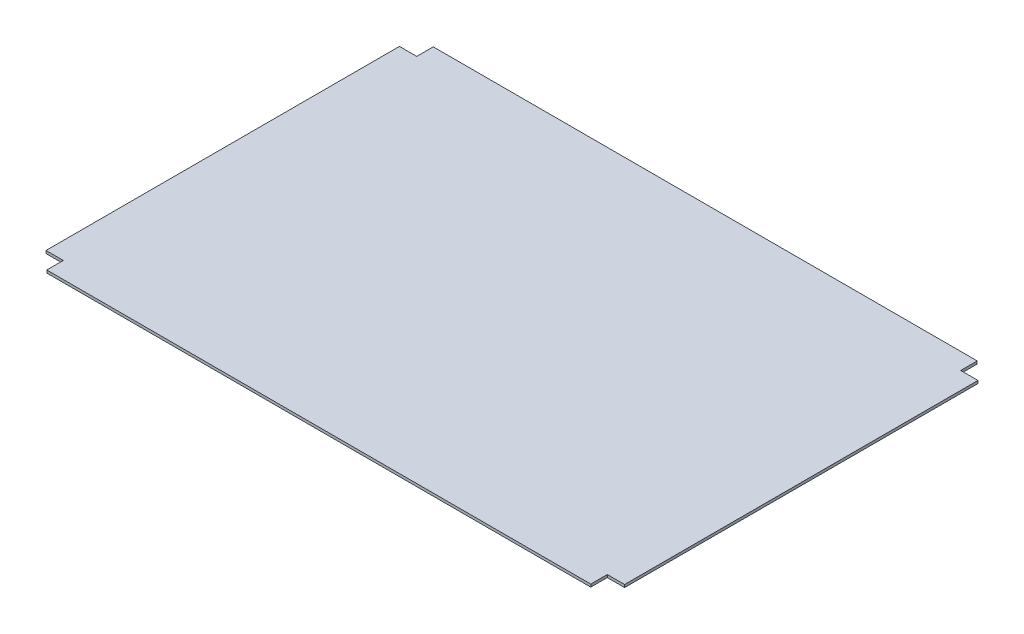
ISO-10303-21;
HEADER;
FILE_DESCRIPTION(('STEP AP214'),'2;1');
FILE_NAME('part.step','',(''),(''),'','','');
FILE_SCHEMA(('AUTOMOTIVE_DESIGN { 1 0 10303 214 1 1 1 1 }'));
ENDSEC;
DATA;
#1=APPLICATION_CONTEXT('core data for automotive mechanical design processes');
#2=APPLICATION_PROTOCOL_DEFINITION('international standard','automotive_design',2000,#1);
#3=PRODUCT_CONTEXT('',#1,'mechanical');
#4=PRODUCT('Part','Part','',(#3));
#5=PRODUCT_RELATED_PRODUCT_CATEGORY('part','',(#4));
#6=PRODUCT_DEFINITION_FORMATION('','',#4);
#7=PRODUCT_DEFINITION_CONTEXT('part definition',#1,'design');
#8=PRODUCT_DEFINITION('design','',#6,#7);
#9=PRODUCT_DEFINITION_SHAPE('','',#8);
#10=(LENGTH_UNIT() NAMED_UNIT(*) SI_UNIT(.MILLI.,.METRE.));
#11=(NAMED_UNIT(*) PLANE_ANGLE_UNIT() SI_UNIT($,.RADIAN.));
#12=(NAMED_UNIT(*) SI_UNIT($,.STERADIAN.) SOLID_ANGLE_UNIT());
#13=UNCERTAINTY_MEASURE_WITH_UNIT(LENGTH_MEASURE(1.E-05),#10,'distance_accuracy_value','');
#14=(GEOMETRIC_REPRESENTATION_CONTEXT(3) GLOBAL_UNCERTAINTY_ASSIGNED_CONTEXT((#13)) GLOBAL_UNIT_ASSIGNED_CONTEXT((#10,
#11,#12)) REPRESENTATION_CONTEXT('',''));
#15=CARTESIAN_POINT('',(0.,0.,0.));
#16=DIRECTION('',(0.,0.,1.));
#17=DIRECTION('',(1.,0.,0.));
#18=AXIS2_PLACEMENT_3D('',#15,#16,#17);
#19=CARTESIAN_POINT('',(-753.,7.,503.));
#20=DIRECTION('',(1.,0.,0.));
#21=DIRECTION('',(0.,0.,-1.));
#22=AXIS2_PLACEMENT_3D('',#19,#20,#21);
#23=PLANE('',#22);
#24=DIRECTION('',(0.,0.,1.));
#25=VECTOR('',#24,1.);
#26=CARTESIAN_POINT('',(-753.,0.,503.));
#27=LINE('',#26,#25);
#28=CARTESIAN_POINT('',(-753.,0.,-460.));
#29=VERTEX_POINT('',#28);
#30=CARTESIAN_POINT('',(-753.,0.,460.));
#31=VERTEX_POINT('',#30);
#32=EDGE_CURVE('E165',#29,#31,#27,.T.);
#33=ORIENTED_EDGE('',*,*,#32,.T.);
#34=DIRECTION('',(0.,1.,0.));
#35=VECTOR('',#34,1.);
#36=CARTESIAN_POINT('',(-753.,-3.,460.));
#37=LINE('',#36,#35);
#38=CARTESIAN_POINT('',(-753.,7.,460.));
#39=VERTEX_POINT('',#38);
#40=EDGE_CURVE('E136',#31,#39,#37,.T.);
#41=ORIENTED_EDGE('',*,*,#40,.T.);
#42=DIRECTION('',(0.,0.,1.));
#43=VECTOR('',#42,1.);
#44=CARTESIAN_POINT('',(-753.,7.,503.));
#45=LINE('',#44,#43);
#46=CARTESIAN_POINT('',(-753.,7.,-460.));
#47=VERTEX_POINT('',#46);
#48=EDGE_CURVE('E153',#47,#39,#45,.T.);
#49=ORIENTED_EDGE('',*,*,#48,.F.);
#50=DIRECTION('',(0.,1.,0.));
#51=VECTOR('',#50,1.);
#52=CARTESIAN_POINT('',(-753.,-3.,-460.));
#53=LINE('',#52,#51);
#54=EDGE_CURVE('E226',#29,#47,#53,.T.);
#55=ORIENTED_EDGE('',*,*,#54,.F.);
#56=EDGE_LOOP('',(#33,#41,#49,#55));
#57=FACE_BOUND('',#56,.T.);
#58=ADVANCED_FACE('F36',(#57),#23,.F.);
#59=CARTESIAN_POINT('',(753.,7.,503.));
#60=DIRECTION('',(0.,0.,-1.));
#61=DIRECTION('',(-1.,0.,0.));
#62=AXIS2_PLACEMENT_3D('',#59,#60,#61);
#63=PLANE('',#62);
#64=DIRECTION('',(1.,0.,0.));
#65=VECTOR('',#64,1.);
#66=CARTESIAN_POINT('',(753.,0.,503.));
#67=LINE('',#66,#65);
#68=CARTESIAN_POINT('',(-708.,0.,503.));
#69=VERTEX_POINT('',#68);
#70=CARTESIAN_POINT('',(708.,0.,503.));
#71=VERTEX_POINT('',#70);
#72=EDGE_CURVE('E168',#69,#71,#67,.T.);
#73=ORIENTED_EDGE('',*,*,#72,.T.);
#74=DIRECTION('',(0.,1.,0.));
#75=VECTOR('',#74,1.);
#76=CARTESIAN_POINT('',(708.,-3.,503.));
#77=LINE('',#76,#75);
#78=CARTESIAN_POINT('',(708.,7.,503.));
#79=VERTEX_POINT('',#78);
#80=EDGE_CURVE('E151',#71,#79,#77,.T.);
#81=ORIENTED_EDGE('',*,*,#80,.T.);
#82=DIRECTION('',(1.,0.,0.));
#83=VECTOR('',#82,1.);
#84=CARTESIAN_POINT('',(753.,7.,503.));
#85=LINE('',#84,#83);
#86=CARTESIAN_POINT('',(-708.,7.,503.));
#87=VERTEX_POINT('',#86);
#88=EDGE_CURVE('E144',#87,#79,#85,.T.);
#89=ORIENTED_EDGE('',*,*,#88,.F.);
#90=DIRECTION('',(0.,1.,0.));
#91=VECTOR('',#90,1.);
#92=CARTESIAN_POINT('',(-708.,-3.,503.));
#93=LINE('',#92,#91);
#94=EDGE_CURVE('E124',#69,#87,#93,.T.);
#95=ORIENTED_EDGE('',*,*,#94,.F.);
#96=EDGE_LOOP('',(#73,#81,#89,#95));
#97=FACE_BOUND('',#96,.T.);
#98=ADVANCED_FACE('F150',(#97),#63,.F.);
#99=CARTESIAN_POINT('',(753.,7.,503.));
#100=DIRECTION('',(-1.,0.,0.));
#101=DIRECTION('',(0.,0.,1.));
#102=AXIS2_PLACEMENT_3D('',#99,#100,#101);
#103=PLANE('',#102);
#104=DIRECTION('',(0.,0.,-1.));
#105=VECTOR('',#104,1.);
#106=CARTESIAN_POINT('',(753.,0.,503.));
#107=LINE('',#106,#105);
#108=CARTESIAN_POINT('',(753.,0.,460.));
#109=VERTEX_POINT('',#108);
#110=CARTESIAN_POINT('',(753.,0.,-460.));
#111=VERTEX_POINT('',#110);
#112=EDGE_CURVE('E171',#109,#111,#107,.T.);
#113=ORIENTED_EDGE('',*,*,#112,.T.);
#114=DIRECTION('',(0.,1.,0.));
#115=VECTOR('',#114,1.);
#116=CARTESIAN_POINT('',(753.,-3.,-460.));
#117=LINE('',#116,#115);
#118=CARTESIAN_POINT('',(753.,7.,-460.));
#119=VERTEX_POINT('',#118);
#120=EDGE_CURVE('E202',#111,#119,#117,.T.);
#121=ORIENTED_EDGE('',*,*,#120,.T.);
#122=DIRECTION('',(0.,0.,-1.));
#123=VECTOR('',#122,1.);
#124=CARTESIAN_POINT('',(753.,7.,503.));
#125=LINE('',#124,#123);
#126=CARTESIAN_POINT('',(753.,7.,460.));
#127=VERTEX_POINT('',#126);
#128=EDGE_CURVE('E152',#127,#119,#125,.T.);
#129=ORIENTED_EDGE('',*,*,#128,.F.);
#130=DIRECTION('',(0.,1.,0.));
#131=VECTOR('',#130,1.);
#132=CARTESIAN_POINT('',(753.,-3.,460.));
#133=LINE('',#132,#131);
#134=EDGE_CURVE('E203',#109,#127,#133,.T.);
#135=ORIENTED_EDGE('',*,*,#134,.F.);
#136=EDGE_LOOP('',(#113,#121,#129,#135));
#137=FACE_BOUND('',#136,.T.);
#138=ADVANCED_FACE('F200',(#137),#103,.F.);
#139=CARTESIAN_POINT('',(753.,7.,-503.));
#140=DIRECTION('',(0.,0.,1.));
#141=DIRECTION('',(1.,0.,0.));
#142=AXIS2_PLACEMENT_3D('',#139,#140,#141);
#143=PLANE('',#142);
#144=DIRECTION('',(-1.,0.,0.));
#145=VECTOR('',#144,1.);
#146=CARTESIAN_POINT('',(753.,7.,-503.));
#147=LINE('',#146,#145);
#148=CARTESIAN_POINT('',(708.,7.,-503.));
#149=VERTEX_POINT('',#148);
#150=CARTESIAN_POINT('',(-708.,7.,-503.));
#151=VERTEX_POINT('',#150);
#152=EDGE_CURVE('E156',#149,#151,#147,.T.);
#153=ORIENTED_EDGE('',*,*,#152,.F.);
#154=DIRECTION('',(0.,1.,0.));
#155=VECTOR('',#154,1.);
#156=CARTESIAN_POINT('',(708.,-3.,-503.));
#157=LINE('',#156,#155);
#158=CARTESIAN_POINT('',(708.,0.,-503.));
#159=VERTEX_POINT('',#158);
#160=EDGE_CURVE('E218',#159,#149,#157,.T.);
#161=ORIENTED_EDGE('',*,*,#160,.F.);
#162=DIRECTION('',(-1.,0.,0.));
#163=VECTOR('',#162,1.);
#164=CARTESIAN_POINT('',(753.,0.,-503.));
#165=LINE('',#164,#163);
#166=CARTESIAN_POINT('',(-708.,0.,-503.));
#167=VERTEX_POINT('',#166);
#168=EDGE_CURVE('E158',#159,#167,#165,.T.);
#169=ORIENTED_EDGE('',*,*,#168,.T.);
#170=DIRECTION('',(0.,1.,0.));
#171=VECTOR('',#170,1.);
#172=CARTESIAN_POINT('',(-708.,-3.,-503.));
#173=LINE('',#172,#171);
#174=EDGE_CURVE('E169',#167,#151,#173,.T.);
#175=ORIENTED_EDGE('',*,*,#174,.T.);
#176=EDGE_LOOP('',(#153,#161,#169,#175));
#177=FACE_BOUND('',#176,.T.);
#178=ADVANCED_FACE('F265',(#177),#143,.F.);
#179=CARTESIAN_POINT('',(0.,7.,0.));
#180=DIRECTION('',(0.,1.,0.));
#181=DIRECTION('',(0.,0.,1.));
#182=AXIS2_PLACEMENT_3D('',#179,#180,#181);
#183=PLANE('',#182);
#184=DIRECTION('',(0.,0.,1.));
#185=VECTOR('',#184,1.);
#186=CARTESIAN_POINT('',(708.,7.,-503.));
#187=LINE('',#186,#185);
#188=CARTESIAN_POINT('',(708.,7.,-460.));
#189=VERTEX_POINT('',#188);
#190=EDGE_CURVE('E211',#149,#189,#187,.T.);
#191=ORIENTED_EDGE('',*,*,#190,.F.);
#192=ORIENTED_EDGE('',*,*,#152,.T.);
#193=DIRECTION('',(0.,0.,-1.));
#194=VECTOR('',#193,1.);
#195=CARTESIAN_POINT('',(-708.,7.,-503.));
#196=LINE('',#195,#194);
#197=CARTESIAN_POINT('',(-708.,7.,-460.));
#198=VERTEX_POINT('',#197);
#199=EDGE_CURVE('E224',#198,#151,#196,.T.);
#200=ORIENTED_EDGE('',*,*,#199,.F.);
#201=DIRECTION('',(1.,0.,0.));
#202=VECTOR('',#201,1.);
#203=CARTESIAN_POINT('',(-708.,7.,-460.));
#204=LINE('',#203,#202);
#205=EDGE_CURVE('E147',#47,#198,#204,.T.);
#206=ORIENTED_EDGE('',*,*,#205,.F.);
#207=ORIENTED_EDGE('',*,*,#48,.T.);
#208=DIRECTION('',(-1.,0.,0.));
#209=VECTOR('',#208,1.);
#210=CARTESIAN_POINT('',(-708.,7.,460.));
#211=LINE('',#210,#209);
#212=CARTESIAN_POINT('',(-708.,7.,460.));
#213=VERTEX_POINT('',#212);
#214=EDGE_CURVE('E146',#213,#39,#211,.T.);
#215=ORIENTED_EDGE('',*,*,#214,.F.);
#216=DIRECTION('',(0.,0.,-1.));
#217=VECTOR('',#216,1.);
#218=CARTESIAN_POINT('',(-708.,7.,503.));
#219=LINE('',#218,#217);
#220=EDGE_CURVE('E128',#87,#213,#219,.T.);
#221=ORIENTED_EDGE('',*,*,#220,.F.);
#222=ORIENTED_EDGE('',*,*,#88,.T.);
#223=DIRECTION('',(0.,0.,1.));
#224=VECTOR('',#223,1.);
#225=CARTESIAN_POINT('',(708.,7.,503.));
#226=LINE('',#225,#224);
#227=CARTESIAN_POINT('',(708.,7.,460.));
#228=VERTEX_POINT('',#227);
#229=EDGE_CURVE('E205',#228,#79,#226,.T.);
#230=ORIENTED_EDGE('',*,*,#229,.F.);
#231=DIRECTION('',(-1.,0.,0.));
#232=VECTOR('',#231,1.);
#233=CARTESIAN_POINT('',(708.,7.,460.));
#234=LINE('',#233,#232);
#235=EDGE_CURVE('E137',#127,#228,#234,.T.);
#236=ORIENTED_EDGE('',*,*,#235,.F.);
#237=ORIENTED_EDGE('',*,*,#128,.T.);
#238=DIRECTION('',(1.,0.,0.));
#239=VECTOR('',#238,1.);
#240=CARTESIAN_POINT('',(708.,7.,-460.));
#241=LINE('',#240,#239);
#242=EDGE_CURVE('E216',#189,#119,#241,.T.);
#243=ORIENTED_EDGE('',*,*,#242,.F.);
#244=EDGE_LOOP('',(#191,#192,#200,#206,#207,#215,#221,#222,#230,#236,#237,#243));
#245=FACE_BOUND('',#244,.T.);
#246=ADVANCED_FACE('F142',(#245),#183,.T.);
#247=CARTESIAN_POINT('',(0.,0.,0.));
#248=DIRECTION('',(0.,1.,0.));
#249=DIRECTION('',(0.,0.,1.));
#250=AXIS2_PLACEMENT_3D('',#247,#248,#249);
#251=PLANE('',#250);
#252=ORIENTED_EDGE('',*,*,#168,.F.);
#253=DIRECTION('',(0.,0.,1.));
#254=VECTOR('',#253,1.);
#255=CARTESIAN_POINT('',(708.,0.,0.));
#256=LINE('',#255,#254);
#257=CARTESIAN_POINT('',(708.,0.,-460.));
#258=VERTEX_POINT('',#257);
#259=EDGE_CURVE('E11',#159,#258,#256,.T.);
#260=ORIENTED_EDGE('',*,*,#259,.T.);
#261=DIRECTION('',(1.,0.,0.));
#262=VECTOR('',#261,1.);
#263=CARTESIAN_POINT('',(0.,0.,-460.));
#264=LINE('',#263,#262);
#265=EDGE_CURVE('E43',#258,#111,#264,.T.);
#266=ORIENTED_EDGE('',*,*,#265,.T.);
#267=ORIENTED_EDGE('',*,*,#112,.F.);
#268=DIRECTION('',(-1.,0.,0.));
#269=VECTOR('',#268,1.);
#270=CARTESIAN_POINT('',(0.,0.,460.));
#271=LINE('',#270,#269);
#272=CARTESIAN_POINT('',(708.,0.,460.));
#273=VERTEX_POINT('',#272);
#274=EDGE_CURVE('E185',#109,#273,#271,.T.);
#275=ORIENTED_EDGE('',*,*,#274,.T.);
#276=DIRECTION('',(0.,0.,1.));
#277=VECTOR('',#276,1.);
#278=CARTESIAN_POINT('',(708.,0.,0.));
#279=LINE('',#278,#277);
#280=EDGE_CURVE('E188',#273,#71,#279,.T.);
#281=ORIENTED_EDGE('',*,*,#280,.T.);
#282=ORIENTED_EDGE('',*,*,#72,.F.);
#283=DIRECTION('',(0.,0.,-1.));
#284=VECTOR('',#283,1.);
#285=CARTESIAN_POINT('',(-708.,0.,0.));
#286=LINE('',#285,#284);
#287=CARTESIAN_POINT('',(-708.,0.,460.));
#288=VERTEX_POINT('',#287);
#289=EDGE_CURVE('E131',#69,#288,#286,.T.);
#290=ORIENTED_EDGE('',*,*,#289,.T.);
#291=DIRECTION('',(-1.,0.,0.));
#292=VECTOR('',#291,1.);
#293=CARTESIAN_POINT('',(0.,0.,460.));
#294=LINE('',#293,#292);
#295=EDGE_CURVE('E181',#288,#31,#294,.T.);
#296=ORIENTED_EDGE('',*,*,#295,.T.);
#297=ORIENTED_EDGE('',*,*,#32,.F.);
#298=DIRECTION('',(1.,0.,0.));
#299=VECTOR('',#298,1.);
#300=CARTESIAN_POINT('',(0.,0.,-460.));
#301=LINE('',#300,#299);
#302=CARTESIAN_POINT('',(-708.,0.,-460.));
#303=VERTEX_POINT('',#302);
#304=EDGE_CURVE('E164',#29,#303,#301,.T.);
#305=ORIENTED_EDGE('',*,*,#304,.T.);
#306=DIRECTION('',(0.,0.,-1.));
#307=VECTOR('',#306,1.);
#308=CARTESIAN_POINT('',(-708.,0.,0.));
#309=LINE('',#308,#307);
#310=EDGE_CURVE('E178',#303,#167,#309,.T.);
#311=ORIENTED_EDGE('',*,*,#310,.T.);
#312=EDGE_LOOP('',(#252,#260,#266,#267,#275,#281,#282,#290,#296,#297,#305,#311));
#313=FACE_BOUND('',#312,.T.);
#314=ADVANCED_FACE('F194',(#313),#251,.F.);
#315=CARTESIAN_POINT('',(-708.,-3.,-503.));
#316=DIRECTION('',(1.,0.,0.));
#317=DIRECTION('',(0.,0.,-1.));
#318=AXIS2_PLACEMENT_3D('',#315,#316,#317);
#319=PLANE('',#318);
#320=DIRECTION('',(0.,1.,0.));
#321=VECTOR('',#320,1.);
#322=CARTESIAN_POINT('',(-708.,-3.,-460.));
#323=LINE('',#322,#321);
#324=EDGE_CURVE('E58',#303,#198,#323,.T.);
#325=ORIENTED_EDGE('',*,*,#324,.T.);
#326=ORIENTED_EDGE('',*,*,#199,.T.);
#327=ORIENTED_EDGE('',*,*,#174,.F.);
#328=ORIENTED_EDGE('',*,*,#310,.F.);
#329=EDGE_LOOP('',(#325,#326,#327,#328));
#330=FACE_BOUND('',#329,.T.);
#331=ADVANCED_FACE('F273',(#330),#319,.F.);
#332=CARTESIAN_POINT('',(-708.,-3.,-460.));
#333=DIRECTION('',(0.,0.,1.));
#334=DIRECTION('',(1.,0.,0.));
#335=AXIS2_PLACEMENT_3D('',#332,#333,#334);
#336=PLANE('',#335);
#337=ORIENTED_EDGE('',*,*,#54,.T.);
#338=ORIENTED_EDGE('',*,*,#205,.T.);
#339=ORIENTED_EDGE('',*,*,#324,.F.);
#340=ORIENTED_EDGE('',*,*,#304,.F.);
#341=EDGE_LOOP('',(#337,#338,#339,#340));
#342=FACE_BOUND('',#341,.T.);
#343=ADVANCED_FACE('F231',(#342),#336,.F.);
#344=CARTESIAN_POINT('',(-708.,-3.,503.));
#345=DIRECTION('',(1.,0.,0.));
#346=DIRECTION('',(0.,0.,-1.));
#347=AXIS2_PLACEMENT_3D('',#344,#345,#346);
#348=PLANE('',#347);
#349=ORIENTED_EDGE('',*,*,#94,.T.);
#350=ORIENTED_EDGE('',*,*,#220,.T.);
#351=DIRECTION('',(0.,1.,0.));
#352=VECTOR('',#351,1.);
#353=CARTESIAN_POINT('',(-708.,-3.,460.));
#354=LINE('',#353,#352);
#355=EDGE_CURVE('E238',#288,#213,#354,.T.);
#356=ORIENTED_EDGE('',*,*,#355,.F.);
#357=ORIENTED_EDGE('',*,*,#289,.F.);
#358=EDGE_LOOP('',(#349,#350,#356,#357));
#359=FACE_BOUND('',#358,.T.);
#360=ADVANCED_FACE('F126',(#359),#348,.F.);
#361=CARTESIAN_POINT('',(-708.,-3.,460.));
#362=DIRECTION('',(0.,0.,-1.));
#363=DIRECTION('',(-1.,0.,0.));
#364=AXIS2_PLACEMENT_3D('',#361,#362,#363);
#365=PLANE('',#364);
#366=ORIENTED_EDGE('',*,*,#355,.T.);
#367=ORIENTED_EDGE('',*,*,#214,.T.);
#368=ORIENTED_EDGE('',*,*,#40,.F.);
#369=ORIENTED_EDGE('',*,*,#295,.F.);
#370=EDGE_LOOP('',(#366,#367,#368,#369));
#371=FACE_BOUND('',#370,.T.);
#372=ADVANCED_FACE('F241',(#371),#365,.F.);
#373=CARTESIAN_POINT('',(708.,-3.,503.));
#374=DIRECTION('',(-1.,0.,0.));
#375=DIRECTION('',(0.,0.,1.));
#376=AXIS2_PLACEMENT_3D('',#373,#374,#375);
#377=PLANE('',#376);
#378=DIRECTION('',(0.,1.,0.));
#379=VECTOR('',#378,1.);
#380=CARTESIAN_POINT('',(708.,-3.,460.));
#381=LINE('',#380,#379);
#382=EDGE_CURVE('E50',#273,#228,#381,.T.);
#383=ORIENTED_EDGE('',*,*,#382,.T.);
#384=ORIENTED_EDGE('',*,*,#229,.T.);
#385=ORIENTED_EDGE('',*,*,#80,.F.);
#386=ORIENTED_EDGE('',*,*,#280,.F.);
#387=EDGE_LOOP('',(#383,#384,#385,#386));
#388=FACE_BOUND('',#387,.T.);
#389=ADVANCED_FACE('F243',(#388),#377,.F.);
#390=CARTESIAN_POINT('',(708.,-3.,460.));
#391=DIRECTION('',(0.,0.,-1.));
#392=DIRECTION('',(-1.,0.,0.));
#393=AXIS2_PLACEMENT_3D('',#390,#391,#392);
#394=PLANE('',#393);
#395=ORIENTED_EDGE('',*,*,#134,.T.);
#396=ORIENTED_EDGE('',*,*,#235,.T.);
#397=ORIENTED_EDGE('',*,*,#382,.F.);
#398=ORIENTED_EDGE('',*,*,#274,.F.);
#399=EDGE_LOOP('',(#395,#396,#397,#398));
#400=FACE_BOUND('',#399,.T.);
#401=ADVANCED_FACE('F245',(#400),#394,.F.);
#402=CARTESIAN_POINT('',(708.,-3.,-503.));
#403=DIRECTION('',(-1.,0.,0.));
#404=DIRECTION('',(0.,0.,1.));
#405=AXIS2_PLACEMENT_3D('',#402,#403,#404);
#406=PLANE('',#405);
#407=ORIENTED_EDGE('',*,*,#160,.T.);
#408=ORIENTED_EDGE('',*,*,#190,.T.);
#409=DIRECTION('',(0.,1.,0.));
#410=VECTOR('',#409,1.);
#411=CARTESIAN_POINT('',(708.,-3.,-460.));
#412=LINE('',#411,#410);
#413=EDGE_CURVE('E214',#258,#189,#412,.T.);
#414=ORIENTED_EDGE('',*,*,#413,.F.);
#415=ORIENTED_EDGE('',*,*,#259,.F.);
#416=EDGE_LOOP('',(#407,#408,#414,#415));
#417=FACE_BOUND('',#416,.T.);
#418=ADVANCED_FACE('F247',(#417),#406,.F.);
#419=CARTESIAN_POINT('',(708.,-3.,-460.));
#420=DIRECTION('',(0.,0.,1.));
#421=DIRECTION('',(1.,0.,0.));
#422=AXIS2_PLACEMENT_3D('',#419,#420,#421);
#423=PLANE('',#422);
#424=ORIENTED_EDGE('',*,*,#413,.T.);
#425=ORIENTED_EDGE('',*,*,#242,.T.);
#426=ORIENTED_EDGE('',*,*,#120,.F.);
#427=ORIENTED_EDGE('',*,*,#265,.F.);
#428=EDGE_LOOP('',(#424,#425,#426,#427));
#429=FACE_BOUND('',#428,.T.);
#430=ADVANCED_FACE('F253',(#429),#423,.F.);
#431=CLOSED_SHELL('',(#58,#98,#138,#178,#246,#314,#331,#343,#360,#372,#389,#401,#418,#430));
#432=MANIFOLD_SOLID_BREP('B2',#431);
#433=ADVANCED_BREP_SHAPE_REPRESENTATION('',(#18,#432),#14);
#434=SHAPE_DEFINITION_REPRESENTATION(#9,#433);
ENDSEC;
END-ISO-10303-21;
